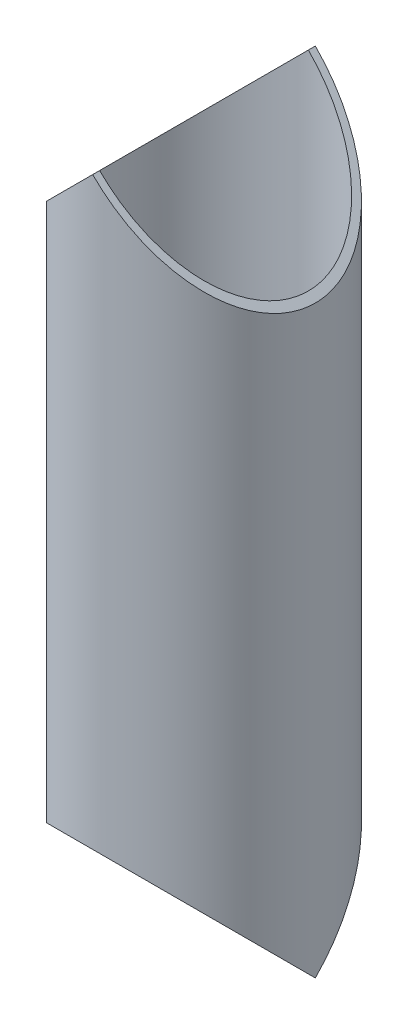
ISO-10303-21;
HEADER;
FILE_DESCRIPTION(('STEP AP214'),'2;1');
FILE_NAME('part.step','',(''),(''),'','','');
FILE_SCHEMA(('AUTOMOTIVE_DESIGN { 1 0 10303 214 1 1 1 1 }'));
ENDSEC;
DATA;
#1=APPLICATION_CONTEXT('core data for automotive mechanical design processes');
#2=APPLICATION_PROTOCOL_DEFINITION('international standard','automotive_design',2000,#1);
#3=PRODUCT_CONTEXT('',#1,'mechanical');
#4=PRODUCT('Part','Part','',(#3));
#5=PRODUCT_RELATED_PRODUCT_CATEGORY('part','',(#4));
#6=PRODUCT_DEFINITION_FORMATION('','',#4);
#7=PRODUCT_DEFINITION_CONTEXT('part definition',#1,'design');
#8=PRODUCT_DEFINITION('design','',#6,#7);
#9=PRODUCT_DEFINITION_SHAPE('','',#8);
#10=(LENGTH_UNIT() NAMED_UNIT(*) SI_UNIT(.MILLI.,.METRE.));
#11=(NAMED_UNIT(*) PLANE_ANGLE_UNIT() SI_UNIT($,.RADIAN.));
#12=(NAMED_UNIT(*) SI_UNIT($,.STERADIAN.) SOLID_ANGLE_UNIT());
#13=UNCERTAINTY_MEASURE_WITH_UNIT(LENGTH_MEASURE(1.E-05),#10,'distance_accuracy_value','');
#14=(GEOMETRIC_REPRESENTATION_CONTEXT(3) GLOBAL_UNCERTAINTY_ASSIGNED_CONTEXT((#13)) GLOBAL_UNIT_ASSIGNED_CONTEXT((#10,
#11,#12)) REPRESENTATION_CONTEXT('',''));
#15=CARTESIAN_POINT('',(0.,0.,0.));
#16=DIRECTION('',(0.,0.,1.));
#17=DIRECTION('',(1.,0.,0.));
#18=AXIS2_PLACEMENT_3D('',#15,#16,#17);
#19=CARTESIAN_POINT('',(0.,158.75,0.));
#20=DIRECTION('',(0.,-1.,0.));
#21=DIRECTION('',(0.,0.,-1.));
#22=AXIS2_PLACEMENT_3D('',#19,#20,#21);
#23=CYLINDRICAL_SURFACE('',#22,25.4);
#24=CARTESIAN_POINT('',(0.,158.75,0.));
#25=DIRECTION('',(0.707106781186547,-0.707106781186548,0.));
#26=DIRECTION('',(-0.707106781186548,-0.707106781186547,0.));
#27=AXIS2_PLACEMENT_3D('',#24,#25,#26);
#28=ELLIPSE('',#27,35.9210244842766,25.4);
#29=CARTESIAN_POINT('',(0.,158.75,25.4));
#30=VERTEX_POINT('',#29);
#31=CARTESIAN_POINT('',(0.,158.75,-25.4));
#32=VERTEX_POINT('',#31);
#33=EDGE_CURVE('E89',#30,#32,#28,.T.);
#34=ORIENTED_EDGE('',*,*,#33,.T.);
#35=CARTESIAN_POINT('',(0.,158.75,0.));
#36=DIRECTION('',(-0.707106781186547,-0.707106781186548,0.));
#37=DIRECTION('',(0.707106781186548,-0.707106781186547,0.));
#38=AXIS2_PLACEMENT_3D('',#35,#36,#37);
#39=ELLIPSE('',#38,35.9210244842766,25.4);
#40=EDGE_CURVE('E87',#32,#30,#39,.T.);
#41=ORIENTED_EDGE('',*,*,#40,.T.);
#42=EDGE_LOOP('',(#34,#41));
#43=FACE_BOUND('',#42,.T.);
#44=CARTESIAN_POINT('',(0.,0.,0.));
#45=DIRECTION('',(0.,0.707106781186548,0.707106781186548));
#46=DIRECTION('',(0.,-0.707106781186548,0.707106781186548));
#47=AXIS2_PLACEMENT_3D('',#44,#45,#46);
#48=ELLIPSE('',#47,35.9210244842766,25.4);
#49=CARTESIAN_POINT('',(25.4,0.,0.));
#50=VERTEX_POINT('',#49);
#51=CARTESIAN_POINT('',(-25.4,0.,0.));
#52=VERTEX_POINT('',#51);
#53=EDGE_CURVE('E48',#50,#52,#48,.T.);
#54=ORIENTED_EDGE('',*,*,#53,.T.);
#55=CARTESIAN_POINT('',(0.,0.,0.));
#56=DIRECTION('',(0.,0.707106781186548,-0.707106781186548));
#57=DIRECTION('',(0.,-0.707106781186548,-0.707106781186548));
#58=AXIS2_PLACEMENT_3D('',#55,#56,#57);
#59=ELLIPSE('',#58,35.9210244842766,25.4);
#60=EDGE_CURVE('E72',#52,#50,#59,.T.);
#61=ORIENTED_EDGE('',*,*,#60,.T.);
#62=EDGE_LOOP('',(#54,#61));
#63=FACE_BOUND('',#62,.T.);
#64=ADVANCED_FACE('F35',(#43,#63),#23,.T.);
#65=CARTESIAN_POINT('',(0.,158.75,0.));
#66=DIRECTION('',(0.,-1.,0.));
#67=DIRECTION('',(0.,0.,-1.));
#68=AXIS2_PLACEMENT_3D('',#65,#66,#67);
#69=CYLINDRICAL_SURFACE('',#68,23.8125);
#70=CARTESIAN_POINT('',(0.,0.,0.));
#71=DIRECTION('',(0.,0.707106781186548,-0.707106781186548));
#72=DIRECTION('',(0.,-0.707106781186548,-0.707106781186548));
#73=AXIS2_PLACEMENT_3D('',#70,#71,#72);
#74=ELLIPSE('',#73,33.6759604540093,23.8125);
#75=CARTESIAN_POINT('',(-23.8125,0.,0.));
#76=VERTEX_POINT('',#75);
#77=CARTESIAN_POINT('',(23.8125,0.,0.));
#78=VERTEX_POINT('',#77);
#79=EDGE_CURVE('E11',#76,#78,#74,.T.);
#80=ORIENTED_EDGE('',*,*,#79,.F.);
#81=CARTESIAN_POINT('',(0.,0.,0.));
#82=DIRECTION('',(0.,0.707106781186548,0.707106781186548));
#83=DIRECTION('',(0.,-0.707106781186548,0.707106781186548));
#84=AXIS2_PLACEMENT_3D('',#81,#82,#83);
#85=ELLIPSE('',#84,33.6759604540093,23.8125);
#86=EDGE_CURVE('E42',#78,#76,#85,.T.);
#87=ORIENTED_EDGE('',*,*,#86,.F.);
#88=EDGE_LOOP('',(#80,#87));
#89=FACE_BOUND('',#88,.T.);
#90=CARTESIAN_POINT('',(0.,158.75,0.));
#91=DIRECTION('',(0.707106781186547,-0.707106781186548,0.));
#92=DIRECTION('',(-0.707106781186548,-0.707106781186547,0.));
#93=AXIS2_PLACEMENT_3D('',#90,#91,#92);
#94=ELLIPSE('',#93,33.6759604540093,23.8125);
#95=CARTESIAN_POINT('',(0.,158.75,23.8125));
#96=VERTEX_POINT('',#95);
#97=CARTESIAN_POINT('',(0.,158.75,-23.8125));
#98=VERTEX_POINT('',#97);
#99=EDGE_CURVE('E93',#96,#98,#94,.T.);
#100=ORIENTED_EDGE('',*,*,#99,.F.);
#101=CARTESIAN_POINT('',(0.,158.75,0.));
#102=DIRECTION('',(-0.707106781186547,-0.707106781186548,0.));
#103=DIRECTION('',(0.707106781186548,-0.707106781186547,0.));
#104=AXIS2_PLACEMENT_3D('',#101,#102,#103);
#105=ELLIPSE('',#104,33.6759604540093,23.8125);
#106=EDGE_CURVE('E91',#98,#96,#105,.T.);
#107=ORIENTED_EDGE('',*,*,#106,.F.);
#108=EDGE_LOOP('',(#100,#107));
#109=FACE_BOUND('',#108,.T.);
#110=ADVANCED_FACE('F96',(#89,#109),#69,.F.);
#111=CARTESIAN_POINT('',(-25.4,133.35,-25.4));
#112=DIRECTION('',(0.707106781186547,-0.707106781186548,0.));
#113=DIRECTION('',(0.707106781186548,0.707106781186547,0.));
#114=AXIS2_PLACEMENT_3D('',#111,#112,#113);
#115=PLANE('',#114);
#116=ORIENTED_EDGE('',*,*,#33,.F.);
#117=DIRECTION('',(0.,0.,1.));
#118=VECTOR('',#117,1.);
#119=CARTESIAN_POINT('',(0.,158.75,-25.4));
#120=LINE('',#119,#118);
#121=EDGE_CURVE('E75',#96,#30,#120,.T.);
#122=ORIENTED_EDGE('',*,*,#121,.F.);
#123=ORIENTED_EDGE('',*,*,#99,.T.);
#124=EDGE_CURVE('E85',#32,#98,#120,.T.);
#125=ORIENTED_EDGE('',*,*,#124,.F.);
#126=EDGE_LOOP('',(#116,#122,#123,#125));
#127=FACE_BOUND('',#126,.T.);
#128=ADVANCED_FACE('F99',(#127),#115,.F.);
#129=CARTESIAN_POINT('',(0.,158.75,-25.4));
#130=DIRECTION('',(-0.707106781186547,-0.707106781186548,0.));
#131=DIRECTION('',(0.707106781186548,-0.707106781186547,0.));
#132=AXIS2_PLACEMENT_3D('',#129,#130,#131);
#133=PLANE('',#132);
#134=ORIENTED_EDGE('',*,*,#40,.F.);
#135=ORIENTED_EDGE('',*,*,#124,.T.);
#136=ORIENTED_EDGE('',*,*,#106,.T.);
#137=ORIENTED_EDGE('',*,*,#121,.T.);
#138=EDGE_LOOP('',(#134,#135,#136,#137));
#139=FACE_BOUND('',#138,.T.);
#140=ADVANCED_FACE('F109',(#139),#133,.F.);
#141=CARTESIAN_POINT('',(-25.4,0.,0.));
#142=DIRECTION('',(0.,0.707106781186548,-0.707106781186548));
#143=DIRECTION('',(0.,0.707106781186548,0.707106781186548));
#144=AXIS2_PLACEMENT_3D('',#141,#142,#143);
#145=PLANE('',#144);
#146=DIRECTION('',(1.,0.,0.));
#147=VECTOR('',#146,1.);
#148=CARTESIAN_POINT('',(-25.4,0.,0.));
#149=LINE('',#148,#147);
#150=EDGE_CURVE('E78',#52,#76,#149,.T.);
#151=ORIENTED_EDGE('',*,*,#150,.T.);
#152=ORIENTED_EDGE('',*,*,#79,.T.);
#153=EDGE_CURVE('E55',#78,#50,#149,.T.);
#154=ORIENTED_EDGE('',*,*,#153,.T.);
#155=ORIENTED_EDGE('',*,*,#60,.F.);
#156=EDGE_LOOP('',(#151,#152,#154,#155));
#157=FACE_BOUND('',#156,.T.);
#158=ADVANCED_FACE('F80',(#157),#145,.F.);
#159=CARTESIAN_POINT('',(-25.4,25.4,-25.4));
#160=DIRECTION('',(0.,0.707106781186548,0.707106781186548));
#161=DIRECTION('',(0.,-0.707106781186548,0.707106781186548));
#162=AXIS2_PLACEMENT_3D('',#159,#160,#161);
#163=PLANE('',#162);
#164=ORIENTED_EDGE('',*,*,#153,.F.);
#165=ORIENTED_EDGE('',*,*,#86,.T.);
#166=ORIENTED_EDGE('',*,*,#150,.F.);
#167=ORIENTED_EDGE('',*,*,#53,.F.);
#168=EDGE_LOOP('',(#164,#165,#166,#167));
#169=FACE_BOUND('',#168,.T.);
#170=ADVANCED_FACE('F77',(#169),#163,.F.);
#171=CLOSED_SHELL('',(#64,#110,#128,#140,#158,#170));
#172=MANIFOLD_SOLID_BREP('B2',#171);
#173=ADVANCED_BREP_SHAPE_REPRESENTATION('',(#18,#172),#14);
#174=SHAPE_DEFINITION_REPRESENTATION(#9,#173);
ENDSEC;
END-ISO-10303-21;
